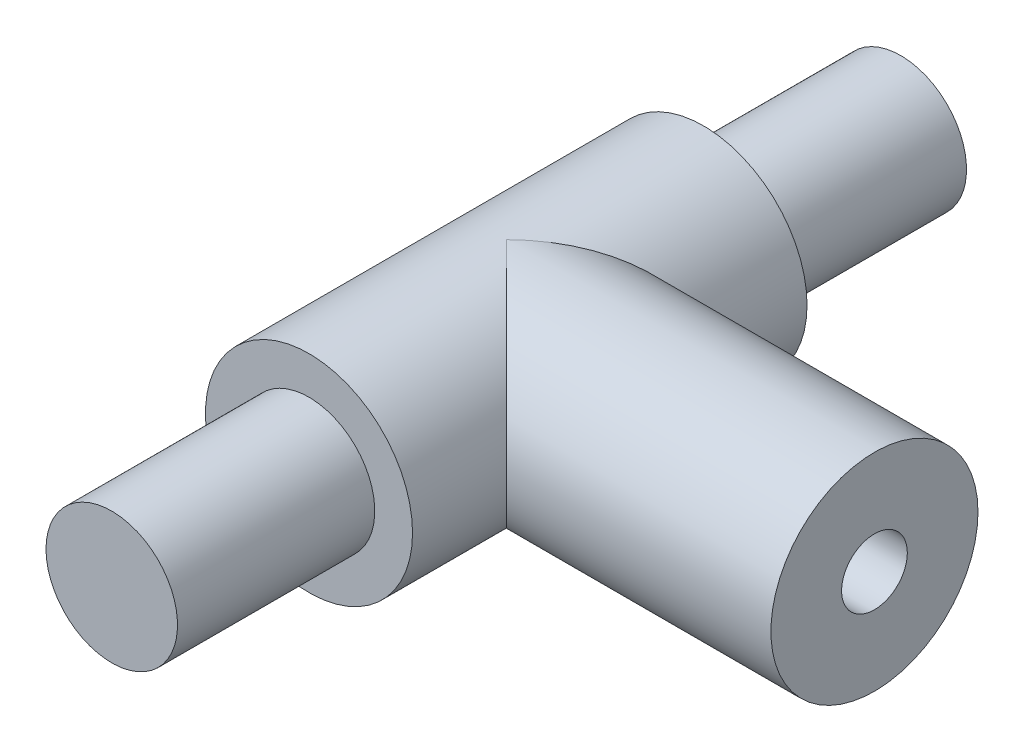
ISO-10303-21;
HEADER;
FILE_DESCRIPTION(('STEP AP214'),'2;1');
FILE_NAME('part.step','',(''),(''),'','','');
FILE_SCHEMA(('AUTOMOTIVE_DESIGN { 1 0 10303 214 1 1 1 1 }'));
ENDSEC;
DATA;
#1=APPLICATION_CONTEXT('core data for automotive mechanical design processes');
#2=APPLICATION_PROTOCOL_DEFINITION('international standard','automotive_design',2000,#1);
#3=PRODUCT_CONTEXT('',#1,'mechanical');
#4=PRODUCT('Part','Part','',(#3));
#5=PRODUCT_RELATED_PRODUCT_CATEGORY('part','',(#4));
#6=PRODUCT_DEFINITION_FORMATION('','',#4);
#7=PRODUCT_DEFINITION_CONTEXT('part definition',#1,'design');
#8=PRODUCT_DEFINITION('design','',#6,#7);
#9=PRODUCT_DEFINITION_SHAPE('','',#8);
#10=(LENGTH_UNIT() NAMED_UNIT(*) SI_UNIT(.MILLI.,.METRE.));
#11=(NAMED_UNIT(*) PLANE_ANGLE_UNIT() SI_UNIT($,.RADIAN.));
#12=(NAMED_UNIT(*) SI_UNIT($,.STERADIAN.) SOLID_ANGLE_UNIT());
#13=UNCERTAINTY_MEASURE_WITH_UNIT(LENGTH_MEASURE(1.E-05),#10,'distance_accuracy_value','');
#14=(GEOMETRIC_REPRESENTATION_CONTEXT(3) GLOBAL_UNCERTAINTY_ASSIGNED_CONTEXT((#13)) GLOBAL_UNIT_ASSIGNED_CONTEXT((#10,
#11,#12)) REPRESENTATION_CONTEXT('',''));
#15=CARTESIAN_POINT('',(0.,0.,0.));
#16=DIRECTION('',(0.,0.,1.));
#17=DIRECTION('',(1.,0.,0.));
#18=AXIS2_PLACEMENT_3D('',#15,#16,#17);
#19=CARTESIAN_POINT('',(0.,0.,9.525));
#20=DIRECTION('',(0.,0.,-1.));
#21=DIRECTION('',(-1.,0.,0.));
#22=AXIS2_PLACEMENT_3D('',#19,#20,#21);
#23=CYLINDRICAL_SURFACE('',#22,5.);
#24=CARTESIAN_POINT('',(0.,0.,-9.525));
#25=DIRECTION('',(0.,0.,1.));
#26=DIRECTION('',(1.,0.,0.));
#27=AXIS2_PLACEMENT_3D('',#24,#25,#26);
#28=CIRCLE('',#27,5.);
#29=CARTESIAN_POINT('',(5.,0.,-9.525));
#30=VERTEX_POINT('',#29);
#31=EDGE_CURVE('E54',#30,#30,#28,.T.);
#32=ORIENTED_EDGE('',*,*,#31,.T.);
#33=EDGE_LOOP('',(#32));
#34=FACE_BOUND('',#33,.T.);
#35=CARTESIAN_POINT('',(0.,0.,9.525));
#36=DIRECTION('',(0.,0.,1.));
#37=DIRECTION('',(1.,0.,0.));
#38=AXIS2_PLACEMENT_3D('',#35,#36,#37);
#39=CIRCLE('',#38,5.);
#40=CARTESIAN_POINT('',(5.,0.,9.525));
#41=VERTEX_POINT('',#40);
#42=EDGE_CURVE('E51',#41,#41,#39,.T.);
#43=ORIENTED_EDGE('',*,*,#42,.F.);
#44=EDGE_LOOP('',(#43));
#45=FACE_BOUND('',#44,.T.);
#46=CARTESIAN_POINT('',(0.,0.,0.));
#47=DIRECTION('',(-0.707106781186548,0.,-0.707106781186547));
#48=DIRECTION('',(0.707106781186548,0.,-0.707106781186547));
#49=AXIS2_PLACEMENT_3D('',#46,#47,#48);
#50=ELLIPSE('',#49,7.07106781186547,5.);
#51=CARTESIAN_POINT('',(0.,-5.,0.));
#52=VERTEX_POINT('',#51);
#53=CARTESIAN_POINT('',(0.,5.,0.));
#54=VERTEX_POINT('',#53);
#55=EDGE_CURVE('E11',#52,#54,#50,.F.);
#56=ORIENTED_EDGE('',*,*,#55,.F.);
#57=CARTESIAN_POINT('',(0.,0.,0.));
#58=DIRECTION('',(0.707106781186548,0.,-0.707106781186547));
#59=DIRECTION('',(-0.707106781186548,0.,-0.707106781186547));
#60=AXIS2_PLACEMENT_3D('',#57,#58,#59);
#61=ELLIPSE('',#60,7.07106781186547,5.);
#62=EDGE_CURVE('E41',#54,#52,#61,.T.);
#63=ORIENTED_EDGE('',*,*,#62,.F.);
#64=EDGE_LOOP('',(#56,#63));
#65=FACE_BOUND('',#64,.T.);
#66=ADVANCED_FACE('F34',(#34,#45,#65),#23,.T.);
#67=CARTESIAN_POINT('',(0.,0.,9.525));
#68=DIRECTION('',(0.,0.,1.));
#69=DIRECTION('',(1.,0.,0.));
#70=AXIS2_PLACEMENT_3D('',#67,#68,#69);
#71=PLANE('',#70);
#72=CARTESIAN_POINT('',(0.,0.,9.525));
#73=DIRECTION('',(0.,0.,1.));
#74=DIRECTION('',(1.,0.,0.));
#75=AXIS2_PLACEMENT_3D('',#72,#73,#74);
#76=CIRCLE('',#75,3.175);
#77=CARTESIAN_POINT('',(-3.175,0.,9.525));
#78=VERTEX_POINT('',#77);
#79=EDGE_CURVE('E57',#78,#78,#76,.F.);
#80=ORIENTED_EDGE('',*,*,#79,.T.);
#81=EDGE_LOOP('',(#80));
#82=FACE_BOUND('',#81,.T.);
#83=ORIENTED_EDGE('',*,*,#42,.T.);
#84=EDGE_LOOP('',(#83));
#85=FACE_BOUND('',#84,.T.);
#86=ADVANCED_FACE('F102',(#82,#85),#71,.T.);
#87=CARTESIAN_POINT('',(0.,0.,-9.525));
#88=DIRECTION('',(0.,0.,1.));
#89=DIRECTION('',(1.,0.,0.));
#90=AXIS2_PLACEMENT_3D('',#87,#88,#89);
#91=PLANE('',#90);
#92=CARTESIAN_POINT('',(0.,0.,-9.525));
#93=DIRECTION('',(0.,0.,1.));
#94=DIRECTION('',(1.,0.,0.));
#95=AXIS2_PLACEMENT_3D('',#92,#93,#94);
#96=CIRCLE('',#95,3.175);
#97=CARTESIAN_POINT('',(-3.175,0.,-9.52500000000001));
#98=VERTEX_POINT('',#97);
#99=EDGE_CURVE('E49',#98,#98,#96,.F.);
#100=ORIENTED_EDGE('',*,*,#99,.F.);
#101=EDGE_LOOP('',(#100));
#102=FACE_BOUND('',#101,.T.);
#103=ORIENTED_EDGE('',*,*,#31,.F.);
#104=EDGE_LOOP('',(#103));
#105=FACE_BOUND('',#104,.T.);
#106=ADVANCED_FACE('F107',(#102,#105),#91,.F.);
#107=CARTESIAN_POINT('',(0.,0.,-19.05));
#108=DIRECTION('',(0.,0.,1.));
#109=DIRECTION('',(1.,0.,0.));
#110=AXIS2_PLACEMENT_3D('',#107,#108,#109);
#111=PLANE('',#110);
#112=CARTESIAN_POINT('',(0.,0.,-19.05));
#113=DIRECTION('',(0.,0.,1.));
#114=DIRECTION('',(1.,0.,0.));
#115=AXIS2_PLACEMENT_3D('',#112,#113,#114);
#116=CIRCLE('',#115,3.175);
#117=CARTESIAN_POINT('',(-3.175,0.,-19.05));
#118=VERTEX_POINT('',#117);
#119=EDGE_CURVE('E63',#118,#118,#116,.T.);
#120=ORIENTED_EDGE('',*,*,#119,.F.);
#121=EDGE_LOOP('',(#120));
#122=FACE_BOUND('',#121,.T.);
#123=ADVANCED_FACE('F116',(#122),#111,.F.);
#124=CARTESIAN_POINT('',(0.,0.,19.05));
#125=DIRECTION('',(0.,0.,-1.));
#126=DIRECTION('',(-1.,0.,0.));
#127=AXIS2_PLACEMENT_3D('',#124,#125,#126);
#128=CYLINDRICAL_SURFACE('',#127,3.175);
#129=CARTESIAN_POINT('',(-3.175,0.,-19.05));
#130=CARTESIAN_POINT('',(-3.175,0.,-18.95078125));
#131=CARTESIAN_POINT('',(-3.175,0.,-18.8515625));
#132=CARTESIAN_POINT('',(-3.175,0.,-18.653125));
#133=CARTESIAN_POINT('',(-3.175,0.,-18.55390625));
#134=CARTESIAN_POINT('',(-3.175,0.,-18.35546875));
#135=CARTESIAN_POINT('',(-3.175,0.,-18.25625));
#136=CARTESIAN_POINT('',(-3.175,0.,-18.0578125));
#137=CARTESIAN_POINT('',(-3.175,0.,-17.95859375));
#138=CARTESIAN_POINT('',(-3.175,0.,-17.76015625));
#139=CARTESIAN_POINT('',(-3.175,0.,-17.6609375));
#140=CARTESIAN_POINT('',(-3.175,0.,-17.4625));
#141=CARTESIAN_POINT('',(-3.175,0.,-17.36328125));
#142=CARTESIAN_POINT('',(-3.175,0.,-17.16484375));
#143=CARTESIAN_POINT('',(-3.175,0.,-17.065625));
#144=CARTESIAN_POINT('',(-3.175,0.,-16.8671875));
#145=CARTESIAN_POINT('',(-3.175,0.,-16.76796875));
#146=CARTESIAN_POINT('',(-3.175,0.,-16.56953125));
#147=CARTESIAN_POINT('',(-3.175,0.,-16.4703125));
#148=CARTESIAN_POINT('',(-3.175,0.,-16.271875));
#149=CARTESIAN_POINT('',(-3.175,0.,-16.17265625));
#150=CARTESIAN_POINT('',(-3.175,0.,-15.97421875));
#151=CARTESIAN_POINT('',(-3.175,0.,-15.875));
#152=CARTESIAN_POINT('',(-3.175,0.,-15.6765625));
#153=CARTESIAN_POINT('',(-3.175,0.,-15.57734375));
#154=CARTESIAN_POINT('',(-3.175,0.,-15.37890625));
#155=CARTESIAN_POINT('',(-3.175,0.,-15.2796875));
#156=CARTESIAN_POINT('',(-3.175,0.,-15.08125));
#157=CARTESIAN_POINT('',(-3.175,0.,-14.98203125));
#158=CARTESIAN_POINT('',(-3.175,0.,-14.78359375));
#159=CARTESIAN_POINT('',(-3.175,0.,-14.684375));
#160=CARTESIAN_POINT('',(-3.175,0.,-14.4859375));
#161=CARTESIAN_POINT('',(-3.175,0.,-14.38671875));
#162=CARTESIAN_POINT('',(-3.175,0.,-14.18828125));
#163=CARTESIAN_POINT('',(-3.175,0.,-14.0890625));
#164=CARTESIAN_POINT('',(-3.175,0.,-13.890625));
#165=CARTESIAN_POINT('',(-3.175,0.,-13.79140625));
#166=CARTESIAN_POINT('',(-3.175,0.,-13.59296875));
#167=CARTESIAN_POINT('',(-3.175,0.,-13.49375));
#168=CARTESIAN_POINT('',(-3.175,0.,-13.2953125));
#169=CARTESIAN_POINT('',(-3.175,0.,-13.19609375));
#170=CARTESIAN_POINT('',(-3.175,0.,-12.99765625));
#171=CARTESIAN_POINT('',(-3.175,0.,-12.8984375));
#172=CARTESIAN_POINT('',(-3.175,0.,-12.7));
#173=CARTESIAN_POINT('',(-3.175,0.,-12.60078125));
#174=CARTESIAN_POINT('',(-3.175,0.,-12.40234375));
#175=CARTESIAN_POINT('',(-3.175,0.,-12.303125));
#176=CARTESIAN_POINT('',(-3.175,0.,-12.1046875));
#177=CARTESIAN_POINT('',(-3.175,0.,-12.00546875));
#178=CARTESIAN_POINT('',(-3.175,0.,-11.80703125));
#179=CARTESIAN_POINT('',(-3.175,0.,-11.7078125));
#180=CARTESIAN_POINT('',(-3.175,0.,-11.509375));
#181=CARTESIAN_POINT('',(-3.175,0.,-11.41015625));
#182=CARTESIAN_POINT('',(-3.175,0.,-11.21171875));
#183=CARTESIAN_POINT('',(-3.175,0.,-11.1125));
#184=CARTESIAN_POINT('',(-3.175,0.,-10.9140625));
#185=CARTESIAN_POINT('',(-3.175,0.,-10.81484375));
#186=CARTESIAN_POINT('',(-3.175,0.,-10.61640625));
#187=CARTESIAN_POINT('',(-3.175,0.,-10.5171875));
#188=CARTESIAN_POINT('',(-3.175,0.,-10.31875));
#189=CARTESIAN_POINT('',(-3.175,0.,-10.21953125));
#190=CARTESIAN_POINT('',(-3.175,0.,-10.02109375));
#191=CARTESIAN_POINT('',(-3.175,0.,-9.92187500000001));
#192=CARTESIAN_POINT('',(-3.175,0.,-9.72343750000001));
#193=CARTESIAN_POINT('',(-3.175,0.,-9.62421875000001));
#194=CARTESIAN_POINT('',(-3.175,0.,-9.52500000000001));
#195=B_SPLINE_CURVE_WITH_KNOTS('',3,(#129,#130,#131,#132,#133,#134,#135,#136,#137,#138,#139,
#140,#141,#142,#143,#144,#145,#146,#147,#148,#149,#150,#151,#152,#153,#154,#155,#156,#157,#158,
#159,#160,#161,#162,#163,#164,#165,#166,#167,#168,#169,#170,#171,#172,#173,#174,#175,#176,#177,
#178,#179,#180,#181,#182,#183,#184,#185,#186,#187,#188,#189,#190,#191,#192,#193,#194),
.UNSPECIFIED.,.F.,.F.,(4,2,2,2,2,2,2,2,2,2,2,2,2,2,2,2,2,2,2,2,2,2,2,2,2,2,2,2,2,2,2,2,4),(0.,
0.29765625,0.5953125,0.892968750000001,1.190625,1.48828125,1.7859375,2.08359375,2.38125,
2.67890625,2.9765625,3.27421875,3.571875,3.86953125,4.1671875,4.46484375,4.7625,5.06015625,
5.3578125,5.65546875,5.953125,6.25078125,6.5484375,6.84609375,7.14374999999999,7.44140624999999,
7.73906249999999,8.03671875,8.33437499999999,8.63203125,8.92968749999999,9.22734375,9.525),.UNSPECIFIED.);
#196=EDGE_CURVE('BSEAM121',#118,#98,#195,.T.);
#197=ORIENTED_EDGE('',*,*,#119,.T.);
#198=ORIENTED_EDGE('',*,*,#99,.T.);
#199=ORIENTED_EDGE('',*,*,#196,.T.);
#200=ORIENTED_EDGE('',*,*,#196,.F.);
#201=EDGE_LOOP('',(#197,#199,#198,#200));
#202=FACE_BOUND('',#201,.T.);
#203=ADVANCED_FACE('F121',(#202),#128,.T.);
#204=CARTESIAN_POINT('',(0.,0.,19.05));
#205=DIRECTION('',(0.,0.,1.));
#206=DIRECTION('',(1.,0.,0.));
#207=AXIS2_PLACEMENT_3D('',#204,#205,#206);
#208=CIRCLE('',#207,3.175);
#209=CARTESIAN_POINT('',(-3.175,0.,19.05));
#210=VERTEX_POINT('',#209);
#211=EDGE_CURVE('E62',#210,#210,#208,.T.);
#212=CARTESIAN_POINT('',(-3.175,0.,9.525));
#213=CARTESIAN_POINT('',(-3.175,0.,9.62421875));
#214=CARTESIAN_POINT('',(-3.175,0.,9.7234375));
#215=CARTESIAN_POINT('',(-3.175,0.,9.921875));
#216=CARTESIAN_POINT('',(-3.175,0.,10.02109375));
#217=CARTESIAN_POINT('',(-3.175,0.,10.21953125));
#218=CARTESIAN_POINT('',(-3.175,0.,10.31875));
#219=CARTESIAN_POINT('',(-3.175,0.,10.5171875));
#220=CARTESIAN_POINT('',(-3.175,0.,10.61640625));
#221=CARTESIAN_POINT('',(-3.175,0.,10.81484375));
#222=CARTESIAN_POINT('',(-3.175,0.,10.9140625));
#223=CARTESIAN_POINT('',(-3.175,0.,11.1125));
#224=CARTESIAN_POINT('',(-3.175,0.,11.21171875));
#225=CARTESIAN_POINT('',(-3.175,0.,11.41015625));
#226=CARTESIAN_POINT('',(-3.175,0.,11.509375));
#227=CARTESIAN_POINT('',(-3.175,0.,11.7078125));
#228=CARTESIAN_POINT('',(-3.175,0.,11.80703125));
#229=CARTESIAN_POINT('',(-3.175,0.,12.00546875));
#230=CARTESIAN_POINT('',(-3.175,0.,12.1046875));
#231=CARTESIAN_POINT('',(-3.175,0.,12.303125));
#232=CARTESIAN_POINT('',(-3.175,0.,12.40234375));
#233=CARTESIAN_POINT('',(-3.175,0.,12.60078125));
#234=CARTESIAN_POINT('',(-3.175,0.,12.7));
#235=CARTESIAN_POINT('',(-3.175,0.,12.8984375));
#236=CARTESIAN_POINT('',(-3.175,0.,12.99765625));
#237=CARTESIAN_POINT('',(-3.175,0.,13.19609375));
#238=CARTESIAN_POINT('',(-3.175,0.,13.2953125));
#239=CARTESIAN_POINT('',(-3.175,0.,13.49375));
#240=CARTESIAN_POINT('',(-3.175,0.,13.59296875));
#241=CARTESIAN_POINT('',(-3.175,0.,13.79140625));
#242=CARTESIAN_POINT('',(-3.175,0.,13.890625));
#243=CARTESIAN_POINT('',(-3.175,0.,14.0890625));
#244=CARTESIAN_POINT('',(-3.175,0.,14.18828125));
#245=CARTESIAN_POINT('',(-3.175,0.,14.38671875));
#246=CARTESIAN_POINT('',(-3.175,0.,14.4859375));
#247=CARTESIAN_POINT('',(-3.175,0.,14.684375));
#248=CARTESIAN_POINT('',(-3.175,0.,14.78359375));
#249=CARTESIAN_POINT('',(-3.175,0.,14.98203125));
#250=CARTESIAN_POINT('',(-3.175,0.,15.08125));
#251=CARTESIAN_POINT('',(-3.175,0.,15.2796875));
#252=CARTESIAN_POINT('',(-3.175,0.,15.37890625));
#253=CARTESIAN_POINT('',(-3.175,0.,15.57734375));
#254=CARTESIAN_POINT('',(-3.175,0.,15.6765625));
#255=CARTESIAN_POINT('',(-3.175,0.,15.875));
#256=CARTESIAN_POINT('',(-3.175,0.,15.97421875));
#257=CARTESIAN_POINT('',(-3.175,0.,16.17265625));
#258=CARTESIAN_POINT('',(-3.175,0.,16.271875));
#259=CARTESIAN_POINT('',(-3.175,0.,16.4703125));
#260=CARTESIAN_POINT('',(-3.175,0.,16.56953125));
#261=CARTESIAN_POINT('',(-3.175,0.,16.76796875));
#262=CARTESIAN_POINT('',(-3.175,0.,16.8671875));
#263=CARTESIAN_POINT('',(-3.175,0.,17.065625));
#264=CARTESIAN_POINT('',(-3.175,0.,17.16484375));
#265=CARTESIAN_POINT('',(-3.175,0.,17.36328125));
#266=CARTESIAN_POINT('',(-3.175,0.,17.4625));
#267=CARTESIAN_POINT('',(-3.175,0.,17.6609375));
#268=CARTESIAN_POINT('',(-3.175,0.,17.76015625));
#269=CARTESIAN_POINT('',(-3.175,0.,17.95859375));
#270=CARTESIAN_POINT('',(-3.175,0.,18.0578125));
#271=CARTESIAN_POINT('',(-3.175,0.,18.25625));
#272=CARTESIAN_POINT('',(-3.175,0.,18.35546875));
#273=CARTESIAN_POINT('',(-3.175,0.,18.55390625));
#274=CARTESIAN_POINT('',(-3.175,0.,18.653125));
#275=CARTESIAN_POINT('',(-3.175,0.,18.8515625));
#276=CARTESIAN_POINT('',(-3.175,0.,18.95078125));
#277=CARTESIAN_POINT('',(-3.175,0.,19.05));
#278=B_SPLINE_CURVE_WITH_KNOTS('',3,(#212,#213,#214,#215,#216,#217,#218,#219,#220,#221,#222,
#223,#224,#225,#226,#227,#228,#229,#230,#231,#232,#233,#234,#235,#236,#237,#238,#239,#240,#241,
#242,#243,#244,#245,#246,#247,#248,#249,#250,#251,#252,#253,#254,#255,#256,#257,#258,#259,#260,
#261,#262,#263,#264,#265,#266,#267,#268,#269,#270,#271,#272,#273,#274,#275,#276,#277),
.UNSPECIFIED.,.F.,.F.,(4,2,2,2,2,2,2,2,2,2,2,2,2,2,2,2,2,2,2,2,2,2,2,2,2,2,2,2,2,2,2,2,4),(0.,
0.29765625,0.5953125,0.892968750000001,1.190625,1.48828125,1.7859375,2.08359375,2.38125,
2.67890625,2.9765625,3.27421875,3.571875,3.86953125,4.1671875,4.46484375,4.7625,5.06015625,
5.3578125,5.65546875,5.953125,6.25078125,6.5484375,6.84609375,7.14375,7.44140625,7.7390625,
8.03671875,8.334375,8.63203125,8.9296875,9.22734375,9.525),.UNSPECIFIED.);
#279=EDGE_CURVE('BSEAM98',#78,#210,#278,.T.);
#280=ORIENTED_EDGE('',*,*,#79,.F.);
#281=ORIENTED_EDGE('',*,*,#211,.F.);
#282=ORIENTED_EDGE('',*,*,#279,.T.);
#283=ORIENTED_EDGE('',*,*,#279,.F.);
#284=EDGE_LOOP('',(#280,#282,#281,#283));
#285=FACE_BOUND('',#284,.T.);
#286=ADVANCED_FACE('F98',(#285),#128,.T.);
#287=CARTESIAN_POINT('',(0.,0.,19.05));
#288=DIRECTION('',(0.,0.,1.));
#289=DIRECTION('',(1.,0.,0.));
#290=AXIS2_PLACEMENT_3D('',#287,#288,#289);
#291=PLANE('',#290);
#292=ORIENTED_EDGE('',*,*,#211,.T.);
#293=EDGE_LOOP('',(#292));
#294=FACE_BOUND('',#293,.T.);
#295=ADVANCED_FACE('F93',(#294),#291,.T.);
#296=CARTESIAN_POINT('',(17.78,0.,0.));
#297=DIRECTION('',(-1.,0.,0.));
#298=DIRECTION('',(0.,0.,1.));
#299=AXIS2_PLACEMENT_3D('',#296,#297,#298);
#300=CYLINDRICAL_SURFACE('',#299,5.);
#301=CARTESIAN_POINT('',(17.78,0.,0.));
#302=DIRECTION('',(1.,0.,0.));
#303=DIRECTION('',(0.,0.,-1.));
#304=AXIS2_PLACEMENT_3D('',#301,#302,#303);
#305=CIRCLE('',#304,5.);
#306=CARTESIAN_POINT('',(17.78,0.,-5.));
#307=VERTEX_POINT('',#306);
#308=EDGE_CURVE('E66',#307,#307,#305,.T.);
#309=ORIENTED_EDGE('',*,*,#308,.F.);
#310=EDGE_LOOP('',(#309));
#311=FACE_BOUND('',#310,.T.);
#312=ORIENTED_EDGE('',*,*,#62,.T.);
#313=ORIENTED_EDGE('',*,*,#55,.T.);
#314=EDGE_LOOP('',(#312,#313));
#315=FACE_BOUND('',#314,.T.);
#316=ADVANCED_FACE('F48',(#311,#315),#300,.T.);
#317=CARTESIAN_POINT('',(17.78,0.,0.));
#318=DIRECTION('',(1.,0.,0.));
#319=DIRECTION('',(0.,0.,-1.));
#320=AXIS2_PLACEMENT_3D('',#317,#318,#319);
#321=PLANE('',#320);
#322=CARTESIAN_POINT('',(17.78,0.,0.));
#323=DIRECTION('',(1.,0.,0.));
#324=DIRECTION('',(0.,0.,-1.));
#325=AXIS2_PLACEMENT_3D('',#322,#323,#324);
#326=CIRCLE('',#325,1.5875);
#327=CARTESIAN_POINT('',(17.78,0.,-1.5875));
#328=VERTEX_POINT('',#327);
#329=EDGE_CURVE('E72',#328,#328,#326,.T.);
#330=ORIENTED_EDGE('',*,*,#329,.F.);
#331=EDGE_LOOP('',(#330));
#332=FACE_BOUND('',#331,.T.);
#333=ORIENTED_EDGE('',*,*,#308,.T.);
#334=EDGE_LOOP('',(#333));
#335=FACE_BOUND('',#334,.T.);
#336=ADVANCED_FACE('F83',(#332,#335),#321,.T.);
#337=CARTESIAN_POINT('',(5.08,0.,0.));
#338=DIRECTION('',(1.,0.,0.));
#339=DIRECTION('',(0.,0.,-1.));
#340=AXIS2_PLACEMENT_3D('',#337,#338,#339);
#341=CYLINDRICAL_SURFACE('',#340,1.5875);
#342=CARTESIAN_POINT('',(5.08,0.,0.));
#343=DIRECTION('',(1.,0.,0.));
#344=DIRECTION('',(0.,0.,-1.));
#345=AXIS2_PLACEMENT_3D('',#342,#343,#344);
#346=CIRCLE('',#345,1.5875);
#347=CARTESIAN_POINT('',(5.08,0.,-1.5875));
#348=VERTEX_POINT('',#347);
#349=EDGE_CURVE('E71',#348,#348,#346,.T.);
#350=ORIENTED_EDGE('',*,*,#349,.F.);
#351=EDGE_LOOP('',(#350));
#352=FACE_BOUND('',#351,.T.);
#353=ORIENTED_EDGE('',*,*,#329,.T.);
#354=EDGE_LOOP('',(#353));
#355=FACE_BOUND('',#354,.T.);
#356=ADVANCED_FACE('F80',(#352,#355),#341,.F.);
#357=CARTESIAN_POINT('',(5.08,0.,0.));
#358=DIRECTION('',(1.,0.,0.));
#359=DIRECTION('',(0.,0.,-1.));
#360=AXIS2_PLACEMENT_3D('',#357,#358,#359);
#361=PLANE('',#360);
#362=ORIENTED_EDGE('',*,*,#349,.T.);
#363=EDGE_LOOP('',(#362));
#364=FACE_BOUND('',#363,.T.);
#365=ADVANCED_FACE('F78',(#364),#361,.T.);
#366=CLOSED_SHELL('',(#66,#86,#106,#123,#203,#286,#295,#316,#336,#356,#365));
#367=MANIFOLD_SOLID_BREP('B2',#366);
#368=ADVANCED_BREP_SHAPE_REPRESENTATION('',(#18,#367),#14);
#369=SHAPE_DEFINITION_REPRESENTATION(#9,#368);
ENDSEC;
END-ISO-10303-21;
